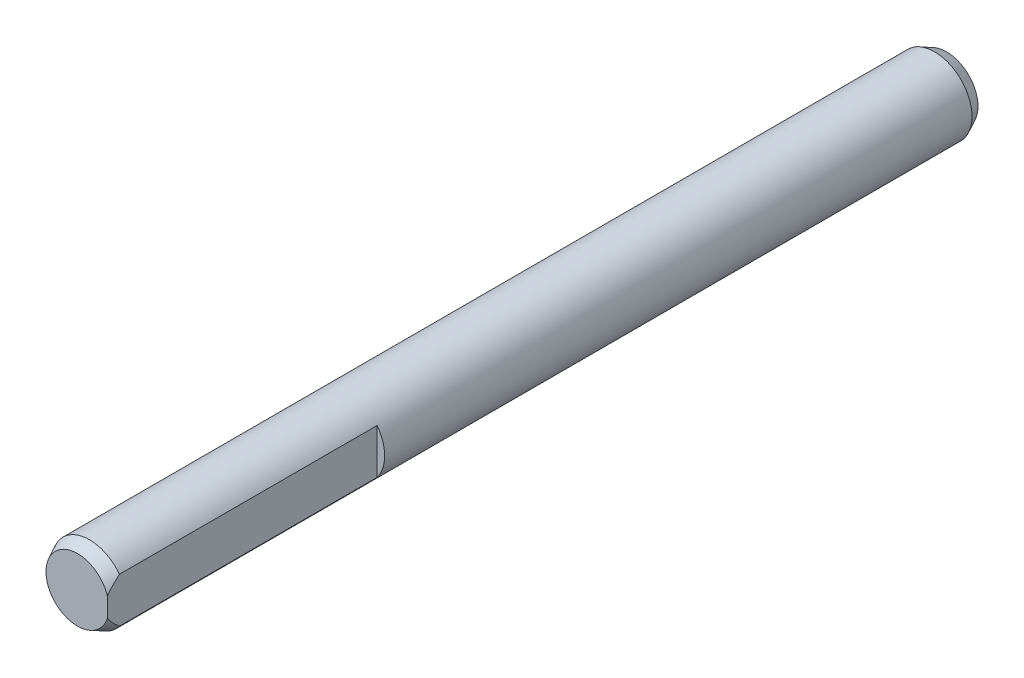
ISO-10303-21;
HEADER;
FILE_DESCRIPTION(('STEP AP214'),'2;1');
FILE_NAME('part.step','',(''),(''),'','','');
FILE_SCHEMA(('AUTOMOTIVE_DESIGN { 1 0 10303 214 1 1 1 1 }'));
ENDSEC;
DATA;
#1=APPLICATION_CONTEXT('core data for automotive mechanical design processes');
#2=APPLICATION_PROTOCOL_DEFINITION('international standard','automotive_design',2000,#1);
#3=PRODUCT_CONTEXT('',#1,'mechanical');
#4=PRODUCT('Part','Part','',(#3));
#5=PRODUCT_RELATED_PRODUCT_CATEGORY('part','',(#4));
#6=PRODUCT_DEFINITION_FORMATION('','',#4);
#7=PRODUCT_DEFINITION_CONTEXT('part definition',#1,'design');
#8=PRODUCT_DEFINITION('design','',#6,#7);
#9=PRODUCT_DEFINITION_SHAPE('','',#8);
#10=(LENGTH_UNIT() NAMED_UNIT(*) SI_UNIT(.MILLI.,.METRE.));
#11=(NAMED_UNIT(*) PLANE_ANGLE_UNIT() SI_UNIT($,.RADIAN.));
#12=(NAMED_UNIT(*) SI_UNIT($,.STERADIAN.) SOLID_ANGLE_UNIT());
#13=UNCERTAINTY_MEASURE_WITH_UNIT(LENGTH_MEASURE(1.E-05),#10,'distance_accuracy_value','');
#14=(GEOMETRIC_REPRESENTATION_CONTEXT(3) GLOBAL_UNCERTAINTY_ASSIGNED_CONTEXT((#13)) GLOBAL_UNIT_ASSIGNED_CONTEXT((#10,
#11,#12)) REPRESENTATION_CONTEXT('',''));
#15=CARTESIAN_POINT('',(0.,0.,0.));
#16=DIRECTION('',(0.,0.,1.));
#17=DIRECTION('',(1.,0.,0.));
#18=AXIS2_PLACEMENT_3D('',#15,#16,#17);
#19=CARTESIAN_POINT('',(0.,0.,58.));
#20=DIRECTION('',(0.,0.,1.));
#21=DIRECTION('',(1.,0.,0.));
#22=AXIS2_PLACEMENT_3D('',#19,#20,#21);
#23=PLANE('',#22);
#24=DIRECTION('',(0.,-1.,0.));
#25=VECTOR('',#24,1.);
#26=CARTESIAN_POINT('',(2.,1.5,58.));
#27=LINE('',#26,#25);
#28=CARTESIAN_POINT('',(2.,0.640312423743,58.));
#29=VERTEX_POINT('',#28);
#30=CARTESIAN_POINT('',(2.,-0.640312423743,58.));
#31=VERTEX_POINT('',#30);
#32=EDGE_CURVE('E117',#29,#31,#27,.T.);
#33=ORIENTED_EDGE('',*,*,#32,.F.);
#34=CARTESIAN_POINT('',(0.,0.,58.));
#35=DIRECTION('',(0.,0.,1.));
#36=DIRECTION('',(0.8,0.6,0.));
#37=AXIS2_PLACEMENT_3D('',#34,#35,#36);
#38=CIRCLE('',#37,2.1);
#39=EDGE_CURVE('E11',#29,#31,#38,.T.);
#40=ORIENTED_EDGE('',*,*,#39,.T.);
#41=EDGE_LOOP('',(#33,#40));
#42=FACE_BOUND('',#41,.T.);
#43=ADVANCED_FACE('F17',(#42),#23,.T.);
#44=CARTESIAN_POINT('',(0.,0.,0.));
#45=DIRECTION('',(0.,0.,1.));
#46=DIRECTION('',(1.,0.,0.));
#47=AXIS2_PLACEMENT_3D('',#44,#45,#46);
#48=PLANE('',#47);
#49=CARTESIAN_POINT('',(0.,0.,0.));
#50=DIRECTION('',(0.,0.,1.));
#51=DIRECTION('',(1.,0.,0.));
#52=AXIS2_PLACEMENT_3D('',#49,#50,#51);
#53=CIRCLE('',#52,2.1);
#54=CARTESIAN_POINT('',(2.1,0.,0.));
#55=VERTEX_POINT('',#54);
#56=EDGE_CURVE('E123',#55,#55,#53,.T.);
#57=ORIENTED_EDGE('',*,*,#56,.F.);
#58=EDGE_LOOP('',(#57));
#59=FACE_BOUND('',#58,.T.);
#60=ADVANCED_FACE('F19',(#59),#48,.F.);
#61=CARTESIAN_POINT('',(0.,0.,57.2));
#62=DIRECTION('',(0.,0.,-1.));
#63=DIRECTION('',(0.8,0.6,0.));
#64=AXIS2_PLACEMENT_3D('',#61,#62,#63);
#65=CONICAL_SURFACE('',#64,2.5,0.463647609001);
#66=CARTESIAN_POINT('',(2.,1.5,57.2));
#67=CARTESIAN_POINT('',(2.,1.03277849116459,57.7606658106025));
#68=CARTESIAN_POINT('',(2.,0.640312423742873,58.));
#69=(BOUNDED_CURVE() B_SPLINE_CURVE(2,(#66,#67,#68),.UNSPECIFIED.,.F.,
.F.) B_SPLINE_CURVE_WITH_KNOTS((3,3),(0.,1.),
.UNSPECIFIED.) CURVE() GEOMETRIC_REPRESENTATION_ITEM() RATIONAL_B_SPLINE_CURVE((1.,
1.01793488030834,1.)) REPRESENTATION_ITEM(''));
#70=CARTESIAN_POINT('',(2.,1.5,57.2));
#71=VERTEX_POINT('',#70);
#72=EDGE_CURVE('E84',#71,#29,#69,.T.);
#73=ORIENTED_EDGE('',*,*,#72,.F.);
#74=CARTESIAN_POINT('',(0.,0.,57.2));
#75=DIRECTION('',(0.,0.,1.));
#76=DIRECTION('',(0.8,0.6,0.));
#77=AXIS2_PLACEMENT_3D('',#74,#75,#76);
#78=CIRCLE('',#77,2.5);
#79=CARTESIAN_POINT('',(2.,-1.5,57.2));
#80=VERTEX_POINT('',#79);
#81=EDGE_CURVE('E95',#71,#80,#78,.T.);
#82=ORIENTED_EDGE('',*,*,#81,.T.);
#83=CARTESIAN_POINT('',(2.,-1.5,57.2));
#84=CARTESIAN_POINT('',(2.,-1.03277849116459,57.7606658106025));
#85=CARTESIAN_POINT('',(2.,-0.640312423742873,58.));
#86=(BOUNDED_CURVE() B_SPLINE_CURVE(2,(#83,#84,#85),.UNSPECIFIED.,.F.,
.F.) B_SPLINE_CURVE_WITH_KNOTS((3,3),(0.,1.),
.UNSPECIFIED.) CURVE() GEOMETRIC_REPRESENTATION_ITEM() RATIONAL_B_SPLINE_CURVE((1.,
1.01793488030834,1.)) REPRESENTATION_ITEM(''));
#87=EDGE_CURVE('E27',#80,#31,#86,.T.);
#88=ORIENTED_EDGE('',*,*,#87,.T.);
#89=ORIENTED_EDGE('',*,*,#39,.F.);
#90=EDGE_LOOP('',(#73,#82,#88,#89));
#91=FACE_BOUND('',#90,.T.);
#92=ADVANCED_FACE('F139',(#91),#65,.T.);
#93=CARTESIAN_POINT('',(2.,1.5,58.));
#94=DIRECTION('',(-1.,0.,0.));
#95=DIRECTION('',(0.,0.,1.));
#96=AXIS2_PLACEMENT_3D('',#93,#94,#95);
#97=PLANE('',#96);
#98=ORIENTED_EDGE('',*,*,#72,.T.);
#99=ORIENTED_EDGE('',*,*,#32,.T.);
#100=ORIENTED_EDGE('',*,*,#87,.F.);
#101=DIRECTION('',(0.,0.,-1.));
#102=VECTOR('',#101,1.);
#103=CARTESIAN_POINT('',(2.,-1.5,58.));
#104=LINE('',#103,#102);
#105=CARTESIAN_POINT('',(2.,-1.5,40.));
#106=VERTEX_POINT('',#105);
#107=EDGE_CURVE('E87',#80,#106,#104,.T.);
#108=ORIENTED_EDGE('',*,*,#107,.T.);
#109=DIRECTION('',(0.,-1.,0.));
#110=VECTOR('',#109,1.);
#111=CARTESIAN_POINT('',(2.,1.5,40.));
#112=LINE('',#111,#110);
#113=CARTESIAN_POINT('',(2.,1.5,40.));
#114=VERTEX_POINT('',#113);
#115=EDGE_CURVE('E21',#114,#106,#112,.T.);
#116=ORIENTED_EDGE('',*,*,#115,.F.);
#117=DIRECTION('',(0.,0.,-1.));
#118=VECTOR('',#117,1.);
#119=CARTESIAN_POINT('',(2.,1.5,58.));
#120=LINE('',#119,#118);
#121=EDGE_CURVE('E109',#71,#114,#120,.T.);
#122=ORIENTED_EDGE('',*,*,#121,.F.);
#123=EDGE_LOOP('',(#98,#99,#100,#108,#116,#122));
#124=FACE_BOUND('',#123,.T.);
#125=ADVANCED_FACE('F89',(#124),#97,.F.);
#126=CARTESIAN_POINT('',(2.15216537029,0.,40.));
#127=DIRECTION('',(0.,0.,1.));
#128=DIRECTION('',(1.,0.,0.));
#129=AXIS2_PLACEMENT_3D('',#126,#127,#128);
#130=PLANE('',#129);
#131=CARTESIAN_POINT('',(0.,0.,40.));
#132=DIRECTION('',(0.,0.,1.));
#133=DIRECTION('',(1.,0.,0.));
#134=AXIS2_PLACEMENT_3D('',#131,#132,#133);
#135=CIRCLE('',#134,2.5);
#136=CARTESIAN_POINT('',(2.5,0.,40.));
#137=VERTEX_POINT('',#136);
#138=EDGE_CURVE('E77',#106,#137,#135,.T.);
#139=ORIENTED_EDGE('',*,*,#138,.T.);
#140=CARTESIAN_POINT('',(0.,0.,40.));
#141=DIRECTION('',(0.,0.,1.));
#142=DIRECTION('',(1.,0.,0.));
#143=AXIS2_PLACEMENT_3D('',#140,#141,#142);
#144=CIRCLE('',#143,2.5);
#145=EDGE_CURVE('E79',#137,#114,#144,.T.);
#146=ORIENTED_EDGE('',*,*,#145,.T.);
#147=ORIENTED_EDGE('',*,*,#115,.T.);
#148=EDGE_LOOP('',(#139,#146,#147));
#149=FACE_BOUND('',#148,.T.);
#150=ADVANCED_FACE('F75',(#149),#130,.T.);
#151=CARTESIAN_POINT('',(0.,0.,0.8));
#152=DIRECTION('',(0.,0.,1.));
#153=DIRECTION('',(1.,0.,0.));
#154=AXIS2_PLACEMENT_3D('',#151,#152,#153);
#155=CONICAL_SURFACE('',#154,2.5,0.463647609001);
#156=ORIENTED_EDGE('',*,*,#56,.T.);
#157=DIRECTION('',(-0.447213595499958,0.,-0.894427190999916));
#158=VECTOR('',#157,1.);
#159=CARTESIAN_POINT('',(2.5,0.,0.8));
#160=LINE('',#159,#158);
#161=CARTESIAN_POINT('',(2.5,0.,0.8));
#162=VERTEX_POINT('',#161);
#163=EDGE_CURVE('E85',#162,#55,#160,.T.);
#164=ORIENTED_EDGE('',*,*,#163,.F.);
#165=CARTESIAN_POINT('',(0.,0.,0.8));
#166=DIRECTION('',(0.,0.,1.));
#167=DIRECTION('',(1.,0.,0.));
#168=AXIS2_PLACEMENT_3D('',#165,#166,#167);
#169=CIRCLE('',#168,2.5);
#170=EDGE_CURVE('E128',#162,#162,#169,.T.);
#171=ORIENTED_EDGE('',*,*,#170,.F.);
#172=ORIENTED_EDGE('',*,*,#163,.T.);
#173=EDGE_LOOP('',(#156,#164,#171,#172));
#174=FACE_BOUND('',#173,.T.);
#175=ADVANCED_FACE('F135',(#174),#155,.T.);
#176=CARTESIAN_POINT('',(0.,0.,0.));
#177=DIRECTION('',(0.,0.,-1.));
#178=DIRECTION('',(1.,0.,0.));
#179=AXIS2_PLACEMENT_3D('',#176,#177,#178);
#180=CYLINDRICAL_SURFACE('',#179,2.5);
#181=ORIENTED_EDGE('',*,*,#138,.F.);
#182=ORIENTED_EDGE('',*,*,#107,.F.);
#183=ORIENTED_EDGE('',*,*,#81,.F.);
#184=ORIENTED_EDGE('',*,*,#121,.T.);
#185=ORIENTED_EDGE('',*,*,#145,.F.);
#186=DIRECTION('',(0.,0.,1.));
#187=VECTOR('',#186,1.);
#188=CARTESIAN_POINT('',(2.5,0.,0.));
#189=LINE('',#188,#187);
#190=EDGE_CURVE('E100',#162,#137,#189,.T.);
#191=ORIENTED_EDGE('',*,*,#190,.F.);
#192=ORIENTED_EDGE('',*,*,#170,.T.);
#193=ORIENTED_EDGE('',*,*,#190,.T.);
#194=EDGE_LOOP('',(#181,#182,#183,#184,#185,#191,#192,#193));
#195=FACE_BOUND('',#194,.T.);
#196=ADVANCED_FACE('F97',(#195),#180,.T.);
#197=CLOSED_SHELL('',(#43,#60,#92,#125,#150,#175,#196));
#198=MANIFOLD_SOLID_BREP('B1',#197);
#199=ADVANCED_BREP_SHAPE_REPRESENTATION('',(#18,#198),#14);
#200=SHAPE_DEFINITION_REPRESENTATION(#9,#199);
ENDSEC;
END-ISO-10303-21;
